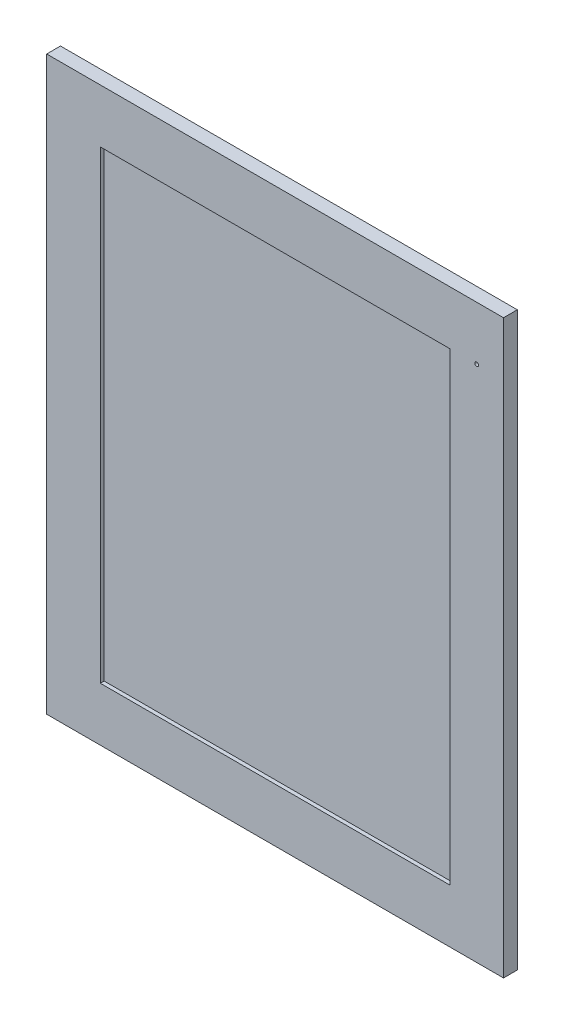
ISO-10303-21;
HEADER;
FILE_DESCRIPTION(('STEP AP214'),'2;1');
FILE_NAME('part.step','',(''),(''),'','','');
FILE_SCHEMA(('AUTOMOTIVE_DESIGN { 1 0 10303 214 1 1 1 1 }'));
ENDSEC;
DATA;
#1=APPLICATION_CONTEXT('core data for automotive mechanical design processes');
#2=APPLICATION_PROTOCOL_DEFINITION('international standard','automotive_design',2000,#1);
#3=PRODUCT_CONTEXT('',#1,'mechanical');
#4=PRODUCT('Part','Part','',(#3));
#5=PRODUCT_RELATED_PRODUCT_CATEGORY('part','',(#4));
#6=PRODUCT_DEFINITION_FORMATION('','',#4);
#7=PRODUCT_DEFINITION_CONTEXT('part definition',#1,'design');
#8=PRODUCT_DEFINITION('design','',#6,#7);
#9=PRODUCT_DEFINITION_SHAPE('','',#8);
#10=(LENGTH_UNIT() NAMED_UNIT(*) SI_UNIT(.MILLI.,.METRE.));
#11=(NAMED_UNIT(*) PLANE_ANGLE_UNIT() SI_UNIT($,.RADIAN.));
#12=(NAMED_UNIT(*) SI_UNIT($,.STERADIAN.) SOLID_ANGLE_UNIT());
#13=UNCERTAINTY_MEASURE_WITH_UNIT(LENGTH_MEASURE(1.E-05),#10,'distance_accuracy_value','');
#14=(GEOMETRIC_REPRESENTATION_CONTEXT(3) GLOBAL_UNCERTAINTY_ASSIGNED_CONTEXT((#13)) GLOBAL_UNIT_ASSIGNED_CONTEXT((#10,
#11,#12)) REPRESENTATION_CONTEXT('',''));
#15=CARTESIAN_POINT('',(0.,0.,0.));
#16=DIRECTION('',(0.,0.,1.));
#17=DIRECTION('',(1.,0.,0.));
#18=AXIS2_PLACEMENT_3D('',#15,#16,#17);
#19=CARTESIAN_POINT('',(0.,-746.,-972.846584535966));
#20=DIRECTION('',(1.,0.,0.));
#21=DIRECTION('',(0.,0.,-1.));
#22=AXIS2_PLACEMENT_3D('',#19,#20,#21);
#23=PLANE('',#22);
#24=DIRECTION('',(0.,-1.,0.));
#25=VECTOR('',#24,1.);
#26=CARTESIAN_POINT('',(0.,-746.,-18.));
#27=LINE('',#26,#25);
#28=CARTESIAN_POINT('',(0.,0.,-18.));
#29=VERTEX_POINT('',#28);
#30=CARTESIAN_POINT('',(0.,-746.,-18.));
#31=VERTEX_POINT('',#30);
#32=EDGE_CURVE('E39',#29,#31,#27,.T.);
#33=ORIENTED_EDGE('',*,*,#32,.F.);
#34=DIRECTION('',(0.,0.,1.));
#35=VECTOR('',#34,1.);
#36=CARTESIAN_POINT('',(0.,0.,-972.846584535966));
#37=LINE('',#36,#35);
#38=CARTESIAN_POINT('',(0.,0.,0.));
#39=VERTEX_POINT('',#38);
#40=EDGE_CURVE('E163',#29,#39,#37,.T.);
#41=ORIENTED_EDGE('',*,*,#40,.T.);
#42=DIRECTION('',(0.,1.,0.));
#43=VECTOR('',#42,1.);
#44=CARTESIAN_POINT('',(0.,-746.,0.));
#45=LINE('',#44,#43);
#46=CARTESIAN_POINT('',(0.,-746.,0.));
#47=VERTEX_POINT('',#46);
#48=EDGE_CURVE('E145',#47,#39,#45,.T.);
#49=ORIENTED_EDGE('',*,*,#48,.F.);
#50=DIRECTION('',(0.,0.,1.));
#51=VECTOR('',#50,1.);
#52=CARTESIAN_POINT('',(0.,-746.,-972.846584535966));
#53=LINE('',#52,#51);
#54=EDGE_CURVE('E71',#31,#47,#53,.T.);
#55=ORIENTED_EDGE('',*,*,#54,.F.);
#56=EDGE_LOOP('',(#33,#41,#49,#55));
#57=FACE_BOUND('',#56,.T.);
#58=ADVANCED_FACE('F32',(#57),#23,.T.);
#59=CARTESIAN_POINT('',(0.,-746.,-972.846584535966));
#60=DIRECTION('',(0.,-1.,0.));
#61=DIRECTION('',(0.,0.,-1.));
#62=AXIS2_PLACEMENT_3D('',#59,#60,#61);
#63=PLANE('',#62);
#64=DIRECTION('',(-1.,0.,0.));
#65=VECTOR('',#64,1.);
#66=CARTESIAN_POINT('',(0.,-746.,-18.));
#67=LINE('',#66,#65);
#68=CARTESIAN_POINT('',(-596.,-746.,-18.));
#69=VERTEX_POINT('',#68);
#70=EDGE_CURVE('E149',#31,#69,#67,.T.);
#71=ORIENTED_EDGE('',*,*,#70,.F.);
#72=ORIENTED_EDGE('',*,*,#54,.T.);
#73=DIRECTION('',(1.,0.,0.));
#74=VECTOR('',#73,1.);
#75=CARTESIAN_POINT('',(0.,-746.,0.));
#76=LINE('',#75,#74);
#77=CARTESIAN_POINT('',(-596.,-746.,0.));
#78=VERTEX_POINT('',#77);
#79=EDGE_CURVE('E160',#78,#47,#76,.T.);
#80=ORIENTED_EDGE('',*,*,#79,.F.);
#81=DIRECTION('',(0.,0.,1.));
#82=VECTOR('',#81,1.);
#83=CARTESIAN_POINT('',(-596.,-746.,-972.846584535966));
#84=LINE('',#83,#82);
#85=EDGE_CURVE('E165',#69,#78,#84,.T.);
#86=ORIENTED_EDGE('',*,*,#85,.F.);
#87=EDGE_LOOP('',(#71,#72,#80,#86));
#88=FACE_BOUND('',#87,.T.);
#89=ADVANCED_FACE('F177',(#88),#63,.T.);
#90=CARTESIAN_POINT('',(-596.,-746.,-972.846584535966));
#91=DIRECTION('',(-1.,0.,0.));
#92=DIRECTION('',(0.,0.,1.));
#93=AXIS2_PLACEMENT_3D('',#90,#91,#92);
#94=PLANE('',#93);
#95=DIRECTION('',(0.,1.,0.));
#96=VECTOR('',#95,1.);
#97=CARTESIAN_POINT('',(-596.,-746.,-18.));
#98=LINE('',#97,#96);
#99=CARTESIAN_POINT('',(-596.,0.,-18.));
#100=VERTEX_POINT('',#99);
#101=EDGE_CURVE('E64',#69,#100,#98,.T.);
#102=ORIENTED_EDGE('',*,*,#101,.F.);
#103=ORIENTED_EDGE('',*,*,#85,.T.);
#104=DIRECTION('',(0.,-1.,0.));
#105=VECTOR('',#104,1.);
#106=CARTESIAN_POINT('',(-596.,-746.,0.));
#107=LINE('',#106,#105);
#108=CARTESIAN_POINT('',(-596.,0.,0.));
#109=VERTEX_POINT('',#108);
#110=EDGE_CURVE('E157',#109,#78,#107,.T.);
#111=ORIENTED_EDGE('',*,*,#110,.F.);
#112=DIRECTION('',(0.,0.,1.));
#113=VECTOR('',#112,1.);
#114=CARTESIAN_POINT('',(-596.,0.,-972.846584535966));
#115=LINE('',#114,#113);
#116=EDGE_CURVE('E167',#100,#109,#115,.T.);
#117=ORIENTED_EDGE('',*,*,#116,.F.);
#118=EDGE_LOOP('',(#102,#103,#111,#117));
#119=FACE_BOUND('',#118,.T.);
#120=ADVANCED_FACE('F179',(#119),#94,.T.);
#121=CARTESIAN_POINT('',(0.,0.,-972.846584535966));
#122=DIRECTION('',(0.,1.,0.));
#123=DIRECTION('',(-1.,0.,0.));
#124=AXIS2_PLACEMENT_3D('',#121,#122,#123);
#125=PLANE('',#124);
#126=DIRECTION('',(1.,0.,0.));
#127=VECTOR('',#126,1.);
#128=CARTESIAN_POINT('',(0.,0.,-18.));
#129=LINE('',#128,#127);
#130=EDGE_CURVE('E11',#100,#29,#129,.T.);
#131=ORIENTED_EDGE('',*,*,#130,.F.);
#132=ORIENTED_EDGE('',*,*,#116,.T.);
#133=DIRECTION('',(-1.,0.,0.));
#134=VECTOR('',#133,1.);
#135=CARTESIAN_POINT('',(0.,0.,0.));
#136=LINE('',#135,#134);
#137=EDGE_CURVE('E154',#39,#109,#136,.T.);
#138=ORIENTED_EDGE('',*,*,#137,.F.);
#139=ORIENTED_EDGE('',*,*,#40,.F.);
#140=EDGE_LOOP('',(#131,#132,#138,#139));
#141=FACE_BOUND('',#140,.T.);
#142=ADVANCED_FACE('F172',(#141),#125,.T.);
#143=CARTESIAN_POINT('',(0.,-746.,0.));
#144=DIRECTION('',(0.,0.,1.));
#145=DIRECTION('',(1.,0.,0.));
#146=AXIS2_PLACEMENT_3D('',#143,#144,#145);
#147=PLANE('',#146);
#148=DIRECTION('',(1.,0.,0.));
#149=VECTOR('',#148,1.);
#150=CARTESIAN_POINT('',(-526.,-676.,0.));
#151=LINE('',#150,#149);
#152=CARTESIAN_POINT('',(-526.,-676.,0.));
#153=VERTEX_POINT('',#152);
#154=CARTESIAN_POINT('',(-70.,-676.,0.));
#155=VERTEX_POINT('',#154);
#156=EDGE_CURVE('E46',#153,#155,#151,.T.);
#157=ORIENTED_EDGE('',*,*,#156,.F.);
#158=DIRECTION('',(0.,-1.,0.));
#159=VECTOR('',#158,1.);
#160=CARTESIAN_POINT('',(-526.,-70.,0.));
#161=LINE('',#160,#159);
#162=CARTESIAN_POINT('',(-526.,-70.,0.));
#163=VERTEX_POINT('',#162);
#164=EDGE_CURVE('E123',#163,#153,#161,.T.);
#165=ORIENTED_EDGE('',*,*,#164,.F.);
#166=DIRECTION('',(-1.,0.,0.));
#167=VECTOR('',#166,1.);
#168=CARTESIAN_POINT('',(-70.,-70.,0.));
#169=LINE('',#168,#167);
#170=CARTESIAN_POINT('',(-70.,-70.,0.));
#171=VERTEX_POINT('',#170);
#172=EDGE_CURVE('E126',#171,#163,#169,.T.);
#173=ORIENTED_EDGE('',*,*,#172,.F.);
#174=DIRECTION('',(0.,1.,0.));
#175=VECTOR('',#174,1.);
#176=CARTESIAN_POINT('',(-70.,-676.,0.));
#177=LINE('',#176,#175);
#178=EDGE_CURVE('E132',#155,#171,#177,.T.);
#179=ORIENTED_EDGE('',*,*,#178,.F.);
#180=EDGE_LOOP('',(#157,#165,#173,#179));
#181=FACE_BOUND('',#180,.T.);
#182=CARTESIAN_POINT('',(-35.,-70.0000000000001,0.));
#183=DIRECTION('',(0.,0.,1.));
#184=DIRECTION('',(1.,0.,0.));
#185=AXIS2_PLACEMENT_3D('',#182,#183,#184);
#186=CIRCLE('',#185,2.5);
#187=CARTESIAN_POINT('',(-32.5,-70.0000000000001,0.));
#188=VERTEX_POINT('',#187);
#189=EDGE_CURVE('E138',#188,#188,#186,.T.);
#190=ORIENTED_EDGE('',*,*,#189,.F.);
#191=EDGE_LOOP('',(#190));
#192=FACE_BOUND('',#191,.T.);
#193=ORIENTED_EDGE('',*,*,#48,.T.);
#194=ORIENTED_EDGE('',*,*,#137,.T.);
#195=ORIENTED_EDGE('',*,*,#110,.T.);
#196=ORIENTED_EDGE('',*,*,#79,.T.);
#197=EDGE_LOOP('',(#193,#194,#195,#196));
#198=FACE_BOUND('',#197,.T.);
#199=ADVANCED_FACE('F175',(#181,#192,#198),#147,.T.);
#200=CARTESIAN_POINT('',(0.,0.,-18.));
#201=DIRECTION('',(0.,0.,1.));
#202=DIRECTION('',(1.,0.,0.));
#203=AXIS2_PLACEMENT_3D('',#200,#201,#202);
#204=PLANE('',#203);
#205=CARTESIAN_POINT('',(-35.,-70.0000000000001,-18.));
#206=DIRECTION('',(0.,0.,1.));
#207=DIRECTION('',(1.,0.,0.));
#208=AXIS2_PLACEMENT_3D('',#205,#206,#207);
#209=CIRCLE('',#208,2.5);
#210=CARTESIAN_POINT('',(-32.5,-70.0000000000001,-18.));
#211=VERTEX_POINT('',#210);
#212=EDGE_CURVE('E142',#211,#211,#209,.T.);
#213=ORIENTED_EDGE('',*,*,#212,.T.);
#214=EDGE_LOOP('',(#213));
#215=FACE_BOUND('',#214,.T.);
#216=ORIENTED_EDGE('',*,*,#32,.T.);
#217=ORIENTED_EDGE('',*,*,#70,.T.);
#218=ORIENTED_EDGE('',*,*,#101,.T.);
#219=ORIENTED_EDGE('',*,*,#130,.T.);
#220=EDGE_LOOP('',(#216,#217,#218,#219));
#221=FACE_BOUND('',#220,.T.);
#222=ADVANCED_FACE('F211',(#215,#221),#204,.F.);
#223=CARTESIAN_POINT('',(-35.,-70.0000000000001,-18.));
#224=DIRECTION('',(0.,0.,1.));
#225=DIRECTION('',(1.,0.,0.));
#226=AXIS2_PLACEMENT_3D('',#223,#224,#225);
#227=CYLINDRICAL_SURFACE('',#226,2.5);
#228=ORIENTED_EDGE('',*,*,#212,.F.);
#229=EDGE_LOOP('',(#228));
#230=FACE_BOUND('',#229,.T.);
#231=ORIENTED_EDGE('',*,*,#189,.T.);
#232=EDGE_LOOP('',(#231));
#233=FACE_BOUND('',#232,.T.);
#234=ADVANCED_FACE('F216',(#230,#233),#227,.F.);
#235=CARTESIAN_POINT('',(-526.,-676.,-5.));
#236=DIRECTION('',(0.,-1.,0.));
#237=DIRECTION('',(0.,0.,-1.));
#238=AXIS2_PLACEMENT_3D('',#235,#236,#237);
#239=PLANE('',#238);
#240=ORIENTED_EDGE('',*,*,#156,.T.);
#241=DIRECTION('',(0.,0.,1.));
#242=VECTOR('',#241,1.);
#243=CARTESIAN_POINT('',(-70.,-676.,-5.));
#244=LINE('',#243,#242);
#245=CARTESIAN_POINT('',(-70.,-676.,-5.));
#246=VERTEX_POINT('',#245);
#247=EDGE_CURVE('E101',#246,#155,#244,.T.);
#248=ORIENTED_EDGE('',*,*,#247,.F.);
#249=DIRECTION('',(1.,0.,0.));
#250=VECTOR('',#249,1.);
#251=CARTESIAN_POINT('',(-526.,-676.,-5.));
#252=LINE('',#251,#250);
#253=CARTESIAN_POINT('',(-526.,-676.,-5.));
#254=VERTEX_POINT('',#253);
#255=EDGE_CURVE('E105',#254,#246,#252,.T.);
#256=ORIENTED_EDGE('',*,*,#255,.F.);
#257=DIRECTION('',(0.,0.,1.));
#258=VECTOR('',#257,1.);
#259=CARTESIAN_POINT('',(-526.,-676.,-5.));
#260=LINE('',#259,#258);
#261=EDGE_CURVE('E136',#254,#153,#260,.T.);
#262=ORIENTED_EDGE('',*,*,#261,.T.);
#263=EDGE_LOOP('',(#240,#248,#256,#262));
#264=FACE_BOUND('',#263,.T.);
#265=ADVANCED_FACE('F103',(#264),#239,.F.);
#266=CARTESIAN_POINT('',(-526.,-70.,-5.));
#267=DIRECTION('',(-1.,0.,0.));
#268=DIRECTION('',(0.,0.,1.));
#269=AXIS2_PLACEMENT_3D('',#266,#267,#268);
#270=PLANE('',#269);
#271=ORIENTED_EDGE('',*,*,#164,.T.);
#272=ORIENTED_EDGE('',*,*,#261,.F.);
#273=DIRECTION('',(0.,-1.,0.));
#274=VECTOR('',#273,1.);
#275=CARTESIAN_POINT('',(-526.,-70.,-5.));
#276=LINE('',#275,#274);
#277=CARTESIAN_POINT('',(-526.,-70.,-5.));
#278=VERTEX_POINT('',#277);
#279=EDGE_CURVE('E111',#278,#254,#276,.T.);
#280=ORIENTED_EDGE('',*,*,#279,.F.);
#281=DIRECTION('',(0.,0.,1.));
#282=VECTOR('',#281,1.);
#283=CARTESIAN_POINT('',(-526.,-70.,-5.));
#284=LINE('',#283,#282);
#285=EDGE_CURVE('E139',#278,#163,#284,.T.);
#286=ORIENTED_EDGE('',*,*,#285,.T.);
#287=EDGE_LOOP('',(#271,#272,#280,#286));
#288=FACE_BOUND('',#287,.T.);
#289=ADVANCED_FACE('F242',(#288),#270,.F.);
#290=CARTESIAN_POINT('',(-70.,-70.,-5.));
#291=DIRECTION('',(0.,1.,0.));
#292=DIRECTION('',(0.,0.,1.));
#293=AXIS2_PLACEMENT_3D('',#290,#291,#292);
#294=PLANE('',#293);
#295=ORIENTED_EDGE('',*,*,#172,.T.);
#296=ORIENTED_EDGE('',*,*,#285,.F.);
#297=DIRECTION('',(-1.,0.,0.));
#298=VECTOR('',#297,1.);
#299=CARTESIAN_POINT('',(-70.,-70.,-5.));
#300=LINE('',#299,#298);
#301=CARTESIAN_POINT('',(-70.,-70.,-5.));
#302=VERTEX_POINT('',#301);
#303=EDGE_CURVE('E119',#302,#278,#300,.T.);
#304=ORIENTED_EDGE('',*,*,#303,.F.);
#305=DIRECTION('',(0.,0.,1.));
#306=VECTOR('',#305,1.);
#307=CARTESIAN_POINT('',(-70.,-70.,-5.));
#308=LINE('',#307,#306);
#309=EDGE_CURVE('E110',#302,#171,#308,.T.);
#310=ORIENTED_EDGE('',*,*,#309,.T.);
#311=EDGE_LOOP('',(#295,#296,#304,#310));
#312=FACE_BOUND('',#311,.T.);
#313=ADVANCED_FACE('F251',(#312),#294,.F.);
#314=CARTESIAN_POINT('',(-70.,-676.,-5.));
#315=DIRECTION('',(1.,0.,0.));
#316=DIRECTION('',(0.,0.,-1.));
#317=AXIS2_PLACEMENT_3D('',#314,#315,#316);
#318=PLANE('',#317);
#319=ORIENTED_EDGE('',*,*,#178,.T.);
#320=ORIENTED_EDGE('',*,*,#309,.F.);
#321=DIRECTION('',(0.,1.,0.));
#322=VECTOR('',#321,1.);
#323=CARTESIAN_POINT('',(-70.,-676.,-5.));
#324=LINE('',#323,#322);
#325=EDGE_CURVE('E114',#246,#302,#324,.T.);
#326=ORIENTED_EDGE('',*,*,#325,.F.);
#327=ORIENTED_EDGE('',*,*,#247,.T.);
#328=EDGE_LOOP('',(#319,#320,#326,#327));
#329=FACE_BOUND('',#328,.T.);
#330=ADVANCED_FACE('F115',(#329),#318,.F.);
#331=CARTESIAN_POINT('',(-70.,-676.,-5.));
#332=DIRECTION('',(0.,0.,1.));
#333=DIRECTION('',(1.,0.,0.));
#334=AXIS2_PLACEMENT_3D('',#331,#332,#333);
#335=PLANE('',#334);
#336=ORIENTED_EDGE('',*,*,#255,.T.);
#337=ORIENTED_EDGE('',*,*,#325,.T.);
#338=ORIENTED_EDGE('',*,*,#303,.T.);
#339=ORIENTED_EDGE('',*,*,#279,.T.);
#340=EDGE_LOOP('',(#336,#337,#338,#339));
#341=FACE_BOUND('',#340,.T.);
#342=ADVANCED_FACE('F121',(#341),#335,.T.);
#343=CLOSED_SHELL('',(#58,#89,#120,#142,#199,#222,#234,#265,#289,#313,#330,#342));
#344=MANIFOLD_SOLID_BREP('B2',#343);
#345=ADVANCED_BREP_SHAPE_REPRESENTATION('',(#18,#344),#14);
#346=SHAPE_DEFINITION_REPRESENTATION(#9,#345);
ENDSEC;
END-ISO-10303-21;
